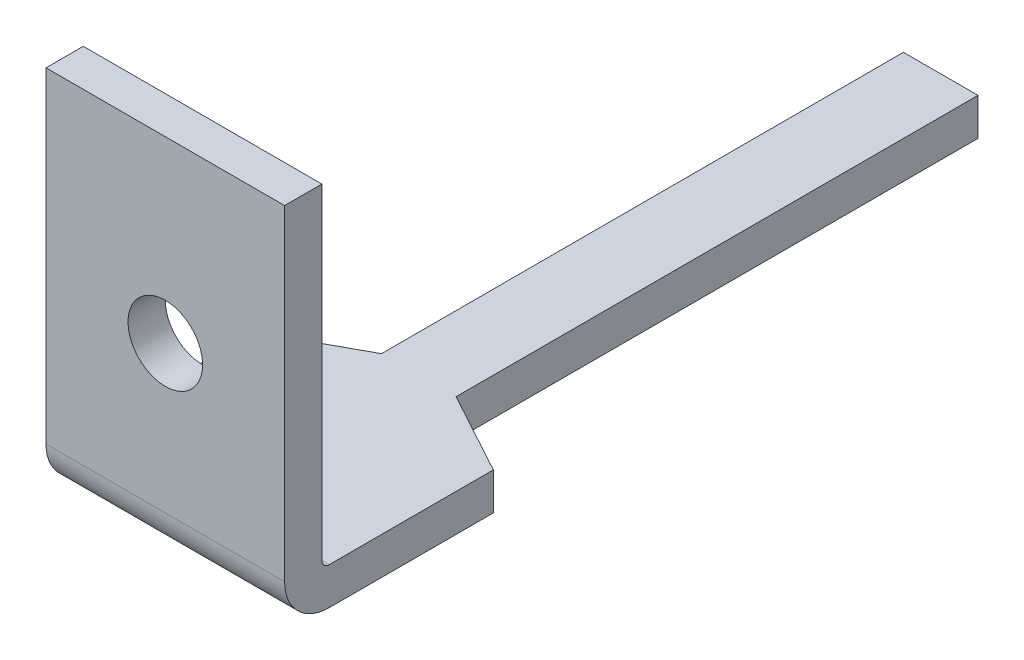
ISO-10303-21;
HEADER;
FILE_DESCRIPTION(('STEP AP214'),'2;1');
FILE_NAME('part.step','',(''),(''),'','','');
FILE_SCHEMA(('AUTOMOTIVE_DESIGN { 1 0 10303 214 1 1 1 1 }'));
ENDSEC;
DATA;
#1=APPLICATION_CONTEXT('core data for automotive mechanical design processes');
#2=APPLICATION_PROTOCOL_DEFINITION('international standard','automotive_design',2000,#1);
#3=PRODUCT_CONTEXT('',#1,'mechanical');
#4=PRODUCT('Part','Part','',(#3));
#5=PRODUCT_RELATED_PRODUCT_CATEGORY('part','',(#4));
#6=PRODUCT_DEFINITION_FORMATION('','',#4);
#7=PRODUCT_DEFINITION_CONTEXT('part definition',#1,'design');
#8=PRODUCT_DEFINITION('design','',#6,#7);
#9=PRODUCT_DEFINITION_SHAPE('','',#8);
#10=(LENGTH_UNIT() NAMED_UNIT(*) SI_UNIT(.MILLI.,.METRE.));
#11=(NAMED_UNIT(*) PLANE_ANGLE_UNIT() SI_UNIT($,.RADIAN.));
#12=(NAMED_UNIT(*) SI_UNIT($,.STERADIAN.) SOLID_ANGLE_UNIT());
#13=UNCERTAINTY_MEASURE_WITH_UNIT(LENGTH_MEASURE(1.E-05),#10,'distance_accuracy_value','');
#14=(GEOMETRIC_REPRESENTATION_CONTEXT(3) GLOBAL_UNCERTAINTY_ASSIGNED_CONTEXT((#13)) GLOBAL_UNIT_ASSIGNED_CONTEXT((#10,
#11,#12)) REPRESENTATION_CONTEXT('',''));
#15=CARTESIAN_POINT('',(0.,0.,0.));
#16=DIRECTION('',(0.,0.,1.));
#17=DIRECTION('',(1.,0.,0.));
#18=AXIS2_PLACEMENT_3D('',#15,#16,#17);
#19=CARTESIAN_POINT('',(0.8,1.285,-5.981239420053));
#20=DIRECTION('',(0.,0.,-1.));
#21=DIRECTION('',(0.,1.,0.));
#22=AXIS2_PLACEMENT_3D('',#19,#20,#21);
#23=CYLINDRICAL_SURFACE('',#22,0.25);
#24=CARTESIAN_POINT('',(0.8,1.285,-0.25));
#25=DIRECTION('',(0.,0.,-1.));
#26=DIRECTION('',(0.,1.,0.));
#27=AXIS2_PLACEMENT_3D('',#24,#25,#26);
#28=CIRCLE('',#27,0.25);
#29=CARTESIAN_POINT('',(0.8,1.535,-0.25));
#30=VERTEX_POINT('',#29);
#31=EDGE_CURVE('E172',#30,#30,#28,.F.);
#32=ORIENTED_EDGE('',*,*,#31,.F.);
#33=EDGE_LOOP('',(#32));
#34=FACE_BOUND('',#33,.T.);
#35=CARTESIAN_POINT('',(0.8,1.285,0.));
#36=DIRECTION('',(0.,0.,-1.));
#37=DIRECTION('',(0.,1.,0.));
#38=AXIS2_PLACEMENT_3D('',#35,#36,#37);
#39=CIRCLE('',#38,0.25);
#40=CARTESIAN_POINT('',(0.8,1.535,0.));
#41=VERTEX_POINT('',#40);
#42=EDGE_CURVE('E157',#41,#41,#39,.T.);
#43=ORIENTED_EDGE('',*,*,#42,.F.);
#44=EDGE_LOOP('',(#43));
#45=FACE_BOUND('',#44,.T.);
#46=ADVANCED_FACE('F17',(#34,#45),#23,.F.);
#47=CARTESIAN_POINT('',(1.6,2.485,-0.25));
#48=DIRECTION('',(0.,1.,0.));
#49=DIRECTION('',(0.,0.,1.));
#50=AXIS2_PLACEMENT_3D('',#47,#48,#49);
#51=PLANE('',#50);
#52=DIRECTION('',(0.,0.,1.));
#53=VECTOR('',#52,1.);
#54=CARTESIAN_POINT('',(1.6,2.485,-0.3));
#55=LINE('',#54,#53);
#56=CARTESIAN_POINT('',(1.6,2.485,0.));
#57=VERTEX_POINT('',#56);
#58=CARTESIAN_POINT('',(1.6,2.485,-0.25));
#59=VERTEX_POINT('',#58);
#60=EDGE_CURVE('E133',#57,#59,#55,.F.);
#61=ORIENTED_EDGE('',*,*,#60,.T.);
#62=DIRECTION('',(1.,0.,0.));
#63=VECTOR('',#62,1.);
#64=CARTESIAN_POINT('',(1.6,2.485,-0.25));
#65=LINE('',#64,#63);
#66=CARTESIAN_POINT('',(0.,2.485,-0.25));
#67=VERTEX_POINT('',#66);
#68=EDGE_CURVE('E175',#67,#59,#65,.T.);
#69=ORIENTED_EDGE('',*,*,#68,.F.);
#70=DIRECTION('',(0.,0.,1.));
#71=VECTOR('',#70,1.);
#72=CARTESIAN_POINT('',(0.,2.485,-0.25));
#73=LINE('',#72,#71);
#74=CARTESIAN_POINT('',(0.,2.485,0.));
#75=VERTEX_POINT('',#74);
#76=EDGE_CURVE('E116',#67,#75,#73,.T.);
#77=ORIENTED_EDGE('',*,*,#76,.T.);
#78=DIRECTION('',(1.,0.,0.));
#79=VECTOR('',#78,1.);
#80=CARTESIAN_POINT('',(1.6,2.485,0.));
#81=LINE('',#80,#79);
#82=EDGE_CURVE('E176',#57,#75,#81,.F.);
#83=ORIENTED_EDGE('',*,*,#82,.F.);
#84=EDGE_LOOP('',(#61,#69,#77,#83));
#85=FACE_BOUND('',#84,.T.);
#86=ADVANCED_FACE('F265',(#85),#51,.T.);
#87=CARTESIAN_POINT('',(1.6,0.3,-0.3));
#88=DIRECTION('',(-1.,0.,0.));
#89=DIRECTION('',(0.,0.,1.));
#90=AXIS2_PLACEMENT_3D('',#87,#88,#89);
#91=PLANE('',#90);
#92=DIRECTION('',(0.,0.,1.));
#93=VECTOR('',#92,1.);
#94=CARTESIAN_POINT('',(1.6,0.25,-0.3));
#95=LINE('',#94,#93);
#96=CARTESIAN_POINT('',(1.6,0.25,-0.3));
#97=VERTEX_POINT('',#96);
#98=CARTESIAN_POINT('',(1.6,0.25,-1.4));
#99=VERTEX_POINT('',#98);
#100=EDGE_CURVE('E140',#97,#99,#95,.F.);
#101=ORIENTED_EDGE('',*,*,#100,.F.);
#102=CARTESIAN_POINT('',(1.6,0.3,-0.3));
#103=DIRECTION('',(1.,0.,0.));
#104=DIRECTION('',(0.,0.,-1.));
#105=AXIS2_PLACEMENT_3D('',#102,#103,#104);
#106=CIRCLE('',#105,0.05);
#107=CARTESIAN_POINT('',(1.6,0.3,-0.25));
#108=VERTEX_POINT('',#107);
#109=EDGE_CURVE('E134',#108,#97,#106,.T.);
#110=ORIENTED_EDGE('',*,*,#109,.F.);
#111=DIRECTION('',(0.,1.,0.));
#112=VECTOR('',#111,1.);
#113=CARTESIAN_POINT('',(1.6,0.3,-0.25));
#114=LINE('',#113,#112);
#115=EDGE_CURVE('E190',#59,#108,#114,.F.);
#116=ORIENTED_EDGE('',*,*,#115,.F.);
#117=ORIENTED_EDGE('',*,*,#60,.F.);
#118=DIRECTION('',(0.,-1.,0.));
#119=VECTOR('',#118,1.);
#120=CARTESIAN_POINT('',(1.6,0.3,0.));
#121=LINE('',#120,#119);
#122=CARTESIAN_POINT('',(1.6,0.3,0.));
#123=VERTEX_POINT('',#122);
#124=EDGE_CURVE('E131',#123,#57,#121,.F.);
#125=ORIENTED_EDGE('',*,*,#124,.F.);
#126=CARTESIAN_POINT('',(1.6,0.3,-0.3));
#127=DIRECTION('',(1.,0.,0.));
#128=DIRECTION('',(0.,0.,-1.));
#129=AXIS2_PLACEMENT_3D('',#126,#127,#128);
#130=CIRCLE('',#129,0.3);
#131=CARTESIAN_POINT('',(1.6,0.,-0.3));
#132=VERTEX_POINT('',#131);
#133=EDGE_CURVE('E20',#132,#123,#130,.F.);
#134=ORIENTED_EDGE('',*,*,#133,.F.);
#135=DIRECTION('',(0.,0.,1.));
#136=VECTOR('',#135,1.);
#137=CARTESIAN_POINT('',(1.6,0.,-0.3));
#138=LINE('',#137,#136);
#139=CARTESIAN_POINT('',(1.6,0.,-1.4));
#140=VERTEX_POINT('',#139);
#141=EDGE_CURVE('E105',#140,#132,#138,.T.);
#142=ORIENTED_EDGE('',*,*,#141,.F.);
#143=DIRECTION('',(0.,1.,0.));
#144=VECTOR('',#143,1.);
#145=CARTESIAN_POINT('',(1.6,0.3,-1.4));
#146=LINE('',#145,#144);
#147=EDGE_CURVE('E155',#99,#140,#146,.F.);
#148=ORIENTED_EDGE('',*,*,#147,.F.);
#149=EDGE_LOOP('',(#101,#110,#116,#117,#125,#134,#142,#148));
#150=FACE_BOUND('',#149,.T.);
#151=ADVANCED_FACE('F129',(#150),#91,.F.);
#152=CARTESIAN_POINT('',(1.6,0.3,0.));
#153=DIRECTION('',(0.,0.,1.));
#154=DIRECTION('',(0.,-1.,0.));
#155=AXIS2_PLACEMENT_3D('',#152,#153,#154);
#156=PLANE('',#155);
#157=ORIENTED_EDGE('',*,*,#124,.T.);
#158=ORIENTED_EDGE('',*,*,#82,.T.);
#159=DIRECTION('',(0.,1.,0.));
#160=VECTOR('',#159,1.);
#161=CARTESIAN_POINT('',(0.,0.3,0.));
#162=LINE('',#161,#160);
#163=CARTESIAN_POINT('',(0.,0.3,0.));
#164=VERTEX_POINT('',#163);
#165=EDGE_CURVE('E170',#164,#75,#162,.T.);
#166=ORIENTED_EDGE('',*,*,#165,.F.);
#167=DIRECTION('',(1.,0.,0.));
#168=VECTOR('',#167,1.);
#169=CARTESIAN_POINT('',(1.6,0.3,0.));
#170=LINE('',#169,#168);
#171=EDGE_CURVE('E186',#123,#164,#170,.F.);
#172=ORIENTED_EDGE('',*,*,#171,.F.);
#173=EDGE_LOOP('',(#157,#158,#166,#172));
#174=FACE_BOUND('',#173,.T.);
#175=ORIENTED_EDGE('',*,*,#42,.T.);
#176=EDGE_LOOP('',(#175));
#177=FACE_BOUND('',#176,.T.);
#178=ADVANCED_FACE('F268',(#174,#177),#156,.T.);
#179=CARTESIAN_POINT('',(1.6,0.3,-0.25));
#180=DIRECTION('',(0.,0.,-1.));
#181=DIRECTION('',(0.,1.,0.));
#182=AXIS2_PLACEMENT_3D('',#179,#180,#181);
#183=PLANE('',#182);
#184=ORIENTED_EDGE('',*,*,#115,.T.);
#185=DIRECTION('',(1.,0.,0.));
#186=VECTOR('',#185,1.);
#187=CARTESIAN_POINT('',(1.6,0.3,-0.25));
#188=LINE('',#187,#186);
#189=CARTESIAN_POINT('',(0.,0.3,-0.25));
#190=VERTEX_POINT('',#189);
#191=EDGE_CURVE('E193',#108,#190,#188,.F.);
#192=ORIENTED_EDGE('',*,*,#191,.T.);
#193=DIRECTION('',(0.,1.,0.));
#194=VECTOR('',#193,1.);
#195=CARTESIAN_POINT('',(0.,0.3,-0.25));
#196=LINE('',#195,#194);
#197=EDGE_CURVE('E168',#67,#190,#196,.F.);
#198=ORIENTED_EDGE('',*,*,#197,.F.);
#199=ORIENTED_EDGE('',*,*,#68,.T.);
#200=EDGE_LOOP('',(#184,#192,#198,#199));
#201=FACE_BOUND('',#200,.T.);
#202=ORIENTED_EDGE('',*,*,#31,.T.);
#203=EDGE_LOOP('',(#202));
#204=FACE_BOUND('',#203,.T.);
#205=ADVANCED_FACE('F263',(#201,#204),#183,.T.);
#206=CARTESIAN_POINT('',(1.6,0.3,-0.3));
#207=DIRECTION('',(1.,0.,0.));
#208=DIRECTION('',(0.,0.,-1.));
#209=AXIS2_PLACEMENT_3D('',#206,#207,#208);
#210=CYLINDRICAL_SURFACE('',#209,0.3);
#211=ORIENTED_EDGE('',*,*,#133,.T.);
#212=ORIENTED_EDGE('',*,*,#171,.T.);
#213=CARTESIAN_POINT('',(0.,0.3,-0.3));
#214=DIRECTION('',(1.,0.,0.));
#215=DIRECTION('',(0.,0.,-1.));
#216=AXIS2_PLACEMENT_3D('',#213,#214,#215);
#217=CIRCLE('',#216,0.3);
#218=CARTESIAN_POINT('',(0.,0.,-0.3));
#219=VERTEX_POINT('',#218);
#220=EDGE_CURVE('E123',#219,#164,#217,.F.);
#221=ORIENTED_EDGE('',*,*,#220,.F.);
#222=DIRECTION('',(1.,0.,0.));
#223=VECTOR('',#222,1.);
#224=CARTESIAN_POINT('',(1.6,0.,-0.3));
#225=LINE('',#224,#223);
#226=EDGE_CURVE('E110',#132,#219,#225,.F.);
#227=ORIENTED_EDGE('',*,*,#226,.F.);
#228=EDGE_LOOP('',(#211,#212,#221,#227));
#229=FACE_BOUND('',#228,.T.);
#230=ADVANCED_FACE('F120',(#229),#210,.T.);
#231=CARTESIAN_POINT('',(0.,0.3,-0.3));
#232=DIRECTION('',(-1.,0.,0.));
#233=DIRECTION('',(0.,0.,1.));
#234=AXIS2_PLACEMENT_3D('',#231,#232,#233);
#235=PLANE('',#234);
#236=CARTESIAN_POINT('',(0.,0.3,-0.3));
#237=DIRECTION('',(1.,0.,0.));
#238=DIRECTION('',(0.,0.,-1.));
#239=AXIS2_PLACEMENT_3D('',#236,#237,#238);
#240=CIRCLE('',#239,0.05);
#241=CARTESIAN_POINT('',(0.,0.25,-0.3));
#242=VERTEX_POINT('',#241);
#243=EDGE_CURVE('E165',#190,#242,#240,.T.);
#244=ORIENTED_EDGE('',*,*,#243,.T.);
#245=DIRECTION('',(0.,0.,1.));
#246=VECTOR('',#245,1.);
#247=CARTESIAN_POINT('',(0.,0.25,-0.3));
#248=LINE('',#247,#246);
#249=CARTESIAN_POINT('',(0.,0.25,-1.4));
#250=VERTEX_POINT('',#249);
#251=EDGE_CURVE('E126',#242,#250,#248,.F.);
#252=ORIENTED_EDGE('',*,*,#251,.T.);
#253=DIRECTION('',(0.,1.,0.));
#254=VECTOR('',#253,1.);
#255=CARTESIAN_POINT('',(0.,0.3,-1.4));
#256=LINE('',#255,#254);
#257=CARTESIAN_POINT('',(0.,0.,-1.4));
#258=VERTEX_POINT('',#257);
#259=EDGE_CURVE('E171',#250,#258,#256,.F.);
#260=ORIENTED_EDGE('',*,*,#259,.T.);
#261=DIRECTION('',(0.,0.,-1.));
#262=VECTOR('',#261,1.);
#263=CARTESIAN_POINT('',(0.,0.,-0.3));
#264=LINE('',#263,#262);
#265=EDGE_CURVE('E125',#219,#258,#264,.T.);
#266=ORIENTED_EDGE('',*,*,#265,.F.);
#267=ORIENTED_EDGE('',*,*,#220,.T.);
#268=ORIENTED_EDGE('',*,*,#165,.T.);
#269=ORIENTED_EDGE('',*,*,#76,.F.);
#270=ORIENTED_EDGE('',*,*,#197,.T.);
#271=EDGE_LOOP('',(#244,#252,#260,#266,#267,#268,#269,#270));
#272=FACE_BOUND('',#271,.T.);
#273=ADVANCED_FACE('F269',(#272),#235,.T.);
#274=CARTESIAN_POINT('',(1.6,0.,-0.3));
#275=DIRECTION('',(0.,-1.,0.));
#276=DIRECTION('',(0.,0.,-1.));
#277=AXIS2_PLACEMENT_3D('',#274,#275,#276);
#278=PLANE('',#277);
#279=DIRECTION('',(0.,0.,1.));
#280=VECTOR('',#279,1.);
#281=CARTESIAN_POINT('',(0.55,0.,-1.7));
#282=LINE('',#281,#280);
#283=CARTESIAN_POINT('',(0.55,0.,-5.2));
#284=VERTEX_POINT('',#283);
#285=CARTESIAN_POINT('',(0.549999999999958,0.,-1.70000000000008));
#286=VERTEX_POINT('',#285);
#287=EDGE_CURVE('E222',#284,#286,#282,.T.);
#288=ORIENTED_EDGE('',*,*,#287,.F.);
#289=DIRECTION('',(-1.,0.,0.));
#290=VECTOR('',#289,1.);
#291=CARTESIAN_POINT('',(1.6,0.,-5.2));
#292=LINE('',#291,#290);
#293=CARTESIAN_POINT('',(1.05,0.,-5.2));
#294=VERTEX_POINT('',#293);
#295=EDGE_CURVE('E227',#294,#284,#292,.T.);
#296=ORIENTED_EDGE('',*,*,#295,.F.);
#297=DIRECTION('',(0.,0.,-1.));
#298=VECTOR('',#297,1.);
#299=CARTESIAN_POINT('',(1.05,0.,-5.2));
#300=LINE('',#299,#298);
#301=CARTESIAN_POINT('',(1.05,0.,-1.7));
#302=VERTEX_POINT('',#301);
#303=EDGE_CURVE('E208',#302,#294,#300,.T.);
#304=ORIENTED_EDGE('',*,*,#303,.F.);
#305=DIRECTION('',(-0.877895572914117,0.,-0.478852130681064));
#306=VECTOR('',#305,1.);
#307=CARTESIAN_POINT('',(1.05,0.,-1.7));
#308=LINE('',#307,#306);
#309=EDGE_CURVE('E112',#140,#302,#308,.T.);
#310=ORIENTED_EDGE('',*,*,#309,.F.);
#311=ORIENTED_EDGE('',*,*,#141,.T.);
#312=ORIENTED_EDGE('',*,*,#226,.T.);
#313=ORIENTED_EDGE('',*,*,#265,.T.);
#314=DIRECTION('',(0.877895572914384,0.,-0.478852130680573));
#315=VECTOR('',#314,1.);
#316=CARTESIAN_POINT('',(0.,0.,-1.4));
#317=LINE('',#316,#315);
#318=EDGE_CURVE('E162',#258,#286,#317,.T.);
#319=ORIENTED_EDGE('',*,*,#318,.T.);
#320=EDGE_LOOP('',(#288,#296,#304,#310,#311,#312,#313,#319));
#321=FACE_BOUND('',#320,.T.);
#322=ADVANCED_FACE('F108',(#321),#278,.T.);
#323=CARTESIAN_POINT('',(1.05,5.981239420053,-1.7));
#324=DIRECTION('',(0.478852130681064,0.,-0.877895572914117));
#325=DIRECTION('',(-0.877895572914117,0.,-0.478852130681064));
#326=AXIS2_PLACEMENT_3D('',#323,#324,#325);
#327=PLANE('',#326);
#328=DIRECTION('',(0.,1.,0.));
#329=VECTOR('',#328,1.);
#330=CARTESIAN_POINT('',(1.05,5.981239420053,-1.7));
#331=LINE('',#330,#329);
#332=CARTESIAN_POINT('',(1.05,0.25,-1.7));
#333=VERTEX_POINT('',#332);
#334=EDGE_CURVE('E161',#333,#302,#331,.F.);
#335=ORIENTED_EDGE('',*,*,#334,.F.);
#336=DIRECTION('',(-0.877895572914384,0.,-0.478852130680573));
#337=VECTOR('',#336,1.);
#338=CARTESIAN_POINT('',(1.6,0.25,-1.4));
#339=LINE('',#338,#337);
#340=EDGE_CURVE('E149',#99,#333,#339,.T.);
#341=ORIENTED_EDGE('',*,*,#340,.F.);
#342=ORIENTED_EDGE('',*,*,#147,.T.);
#343=ORIENTED_EDGE('',*,*,#309,.T.);
#344=EDGE_LOOP('',(#335,#341,#342,#343));
#345=FACE_BOUND('',#344,.T.);
#346=ADVANCED_FACE('F204',(#345),#327,.T.);
#347=CARTESIAN_POINT('',(1.05,5.981239420053,-5.2));
#348=DIRECTION('',(1.,0.,0.));
#349=DIRECTION('',(0.,0.,-1.));
#350=AXIS2_PLACEMENT_3D('',#347,#348,#349);
#351=PLANE('',#350);
#352=DIRECTION('',(0.,1.,0.));
#353=VECTOR('',#352,1.);
#354=CARTESIAN_POINT('',(1.05,0.25,-5.2));
#355=LINE('',#354,#353);
#356=CARTESIAN_POINT('',(1.05,0.25,-5.2));
#357=VERTEX_POINT('',#356);
#358=EDGE_CURVE('E212',#357,#294,#355,.F.);
#359=ORIENTED_EDGE('',*,*,#358,.F.);
#360=DIRECTION('',(0.,0.,1.));
#361=VECTOR('',#360,1.);
#362=CARTESIAN_POINT('',(1.05,0.25,-5.2));
#363=LINE('',#362,#361);
#364=EDGE_CURVE('E152',#333,#357,#363,.F.);
#365=ORIENTED_EDGE('',*,*,#364,.F.);
#366=ORIENTED_EDGE('',*,*,#334,.T.);
#367=ORIENTED_EDGE('',*,*,#303,.T.);
#368=EDGE_LOOP('',(#359,#365,#366,#367));
#369=FACE_BOUND('',#368,.T.);
#370=ADVANCED_FACE('F210',(#369),#351,.T.);
#371=CARTESIAN_POINT('',(1.6,0.25,-5.2));
#372=DIRECTION('',(0.,0.,-1.));
#373=DIRECTION('',(-1.,0.,0.));
#374=AXIS2_PLACEMENT_3D('',#371,#372,#373);
#375=PLANE('',#374);
#376=ORIENTED_EDGE('',*,*,#295,.T.);
#377=DIRECTION('',(0.,1.,0.));
#378=VECTOR('',#377,1.);
#379=CARTESIAN_POINT('',(0.55,5.981239420053,-5.2));
#380=LINE('',#379,#378);
#381=CARTESIAN_POINT('',(0.55,0.25,-5.2));
#382=VERTEX_POINT('',#381);
#383=EDGE_CURVE('E224',#382,#284,#380,.F.);
#384=ORIENTED_EDGE('',*,*,#383,.F.);
#385=DIRECTION('',(1.,0.,0.));
#386=VECTOR('',#385,1.);
#387=CARTESIAN_POINT('',(1.6,0.25,-5.2));
#388=LINE('',#387,#386);
#389=EDGE_CURVE('E215',#357,#382,#388,.F.);
#390=ORIENTED_EDGE('',*,*,#389,.F.);
#391=ORIENTED_EDGE('',*,*,#358,.T.);
#392=EDGE_LOOP('',(#376,#384,#390,#391));
#393=FACE_BOUND('',#392,.T.);
#394=ADVANCED_FACE('F277',(#393),#375,.T.);
#395=CARTESIAN_POINT('',(0.55,5.981239420053,-1.7));
#396=DIRECTION('',(-1.,0.,0.));
#397=DIRECTION('',(0.,0.,1.));
#398=AXIS2_PLACEMENT_3D('',#395,#396,#397);
#399=PLANE('',#398);
#400=DIRECTION('',(0.,1.,0.));
#401=VECTOR('',#400,1.);
#402=CARTESIAN_POINT('',(0.549999999999833,5.981239420053,-1.70000000000031));
#403=LINE('',#402,#401);
#404=CARTESIAN_POINT('',(0.549999999999958,0.25,-1.70000000000008));
#405=VERTEX_POINT('',#404);
#406=EDGE_CURVE('E35',#405,#286,#403,.F.);
#407=ORIENTED_EDGE('',*,*,#406,.F.);
#408=DIRECTION('',(0.,0.,1.));
#409=VECTOR('',#408,1.);
#410=CARTESIAN_POINT('',(0.55,0.25,-5.2));
#411=LINE('',#410,#409);
#412=EDGE_CURVE('E217',#382,#405,#411,.T.);
#413=ORIENTED_EDGE('',*,*,#412,.F.);
#414=ORIENTED_EDGE('',*,*,#383,.T.);
#415=ORIENTED_EDGE('',*,*,#287,.T.);
#416=EDGE_LOOP('',(#407,#413,#414,#415));
#417=FACE_BOUND('',#416,.T.);
#418=ADVANCED_FACE('F273',(#417),#399,.T.);
#419=CARTESIAN_POINT('',(0.,5.981239420053,-1.4));
#420=DIRECTION('',(-0.478852130681064,0.,-0.877895572914117));
#421=DIRECTION('',(-0.877895572914117,0.,0.478852130681064));
#422=AXIS2_PLACEMENT_3D('',#419,#420,#421);
#423=PLANE('',#422);
#424=ORIENTED_EDGE('',*,*,#259,.F.);
#425=DIRECTION('',(-0.877895572914384,0.,0.478852130680573));
#426=VECTOR('',#425,1.);
#427=CARTESIAN_POINT('',(0.55,0.25,-1.7));
#428=LINE('',#427,#426);
#429=EDGE_CURVE('E26',#405,#250,#428,.T.);
#430=ORIENTED_EDGE('',*,*,#429,.F.);
#431=ORIENTED_EDGE('',*,*,#406,.T.);
#432=ORIENTED_EDGE('',*,*,#318,.F.);
#433=EDGE_LOOP('',(#424,#430,#431,#432));
#434=FACE_BOUND('',#433,.T.);
#435=ADVANCED_FACE('F274',(#434),#423,.T.);
#436=CARTESIAN_POINT('',(1.6,0.3,-0.3));
#437=DIRECTION('',(1.,0.,0.));
#438=DIRECTION('',(0.,0.,-1.));
#439=AXIS2_PLACEMENT_3D('',#436,#437,#438);
#440=CYLINDRICAL_SURFACE('',#439,0.05);
#441=ORIENTED_EDGE('',*,*,#191,.F.);
#442=ORIENTED_EDGE('',*,*,#109,.T.);
#443=DIRECTION('',(1.,0.,0.));
#444=VECTOR('',#443,1.);
#445=CARTESIAN_POINT('',(1.6,0.250000000000001,-0.3));
#446=LINE('',#445,#444);
#447=EDGE_CURVE('E11',#242,#97,#446,.T.);
#448=ORIENTED_EDGE('',*,*,#447,.F.);
#449=ORIENTED_EDGE('',*,*,#243,.F.);
#450=EDGE_LOOP('',(#441,#442,#448,#449));
#451=FACE_BOUND('',#450,.T.);
#452=ADVANCED_FACE('F288',(#451),#440,.F.);
#453=CARTESIAN_POINT('',(1.6,0.25,-5.2));
#454=DIRECTION('',(0.,1.,0.));
#455=DIRECTION('',(0.,0.,1.));
#456=AXIS2_PLACEMENT_3D('',#453,#454,#455);
#457=PLANE('',#456);
#458=ORIENTED_EDGE('',*,*,#251,.F.);
#459=ORIENTED_EDGE('',*,*,#447,.T.);
#460=ORIENTED_EDGE('',*,*,#100,.T.);
#461=ORIENTED_EDGE('',*,*,#340,.T.);
#462=ORIENTED_EDGE('',*,*,#364,.T.);
#463=ORIENTED_EDGE('',*,*,#389,.T.);
#464=ORIENTED_EDGE('',*,*,#412,.T.);
#465=ORIENTED_EDGE('',*,*,#429,.T.);
#466=EDGE_LOOP('',(#458,#459,#460,#461,#462,#463,#464,#465));
#467=FACE_BOUND('',#466,.T.);
#468=ADVANCED_FACE('F200',(#467),#457,.T.);
#469=CLOSED_SHELL('',(#46,#86,#151,#178,#205,#230,#273,#322,#346,#370,#394,#418,#435,#452,#468));
#470=MANIFOLD_SOLID_BREP('B1',#469);
#471=ADVANCED_BREP_SHAPE_REPRESENTATION('',(#18,#470),#14);
#472=SHAPE_DEFINITION_REPRESENTATION(#9,#471);
ENDSEC;
END-ISO-10303-21;
